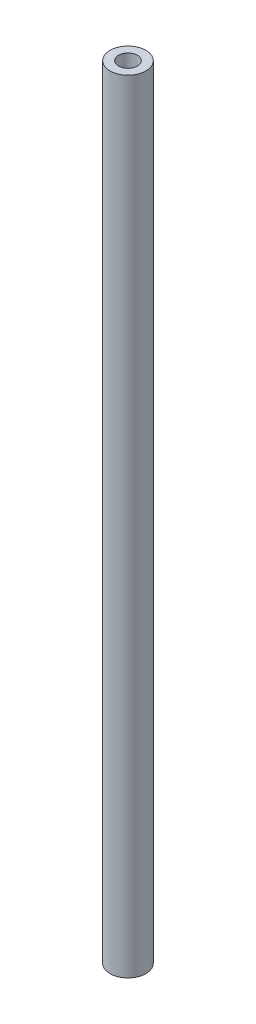
ISO-10303-21;
HEADER;
FILE_DESCRIPTION(('STEP AP214'),'2;1');
FILE_NAME('part.step','',(''),(''),'','','');
FILE_SCHEMA(('AUTOMOTIVE_DESIGN { 1 0 10303 214 1 1 1 1 }'));
ENDSEC;
DATA;
#1=APPLICATION_CONTEXT('core data for automotive mechanical design processes');
#2=APPLICATION_PROTOCOL_DEFINITION('international standard','automotive_design',2000,#1);
#3=PRODUCT_CONTEXT('',#1,'mechanical');
#4=PRODUCT('Part','Part','',(#3));
#5=PRODUCT_RELATED_PRODUCT_CATEGORY('part','',(#4));
#6=PRODUCT_DEFINITION_FORMATION('','',#4);
#7=PRODUCT_DEFINITION_CONTEXT('part definition',#1,'design');
#8=PRODUCT_DEFINITION('design','',#6,#7);
#9=PRODUCT_DEFINITION_SHAPE('','',#8);
#10=(LENGTH_UNIT() NAMED_UNIT(*) SI_UNIT(.MILLI.,.METRE.));
#11=(NAMED_UNIT(*) PLANE_ANGLE_UNIT() SI_UNIT($,.RADIAN.));
#12=(NAMED_UNIT(*) SI_UNIT($,.STERADIAN.) SOLID_ANGLE_UNIT());
#13=UNCERTAINTY_MEASURE_WITH_UNIT(LENGTH_MEASURE(1.E-05),#10,'distance_accuracy_value','');
#14=(GEOMETRIC_REPRESENTATION_CONTEXT(3) GLOBAL_UNCERTAINTY_ASSIGNED_CONTEXT((#13)) GLOBAL_UNIT_ASSIGNED_CONTEXT((#10,
#11,#12)) REPRESENTATION_CONTEXT('',''));
#15=CARTESIAN_POINT('',(0.,0.,0.));
#16=DIRECTION('',(0.,0.,1.));
#17=DIRECTION('',(1.,0.,0.));
#18=AXIS2_PLACEMENT_3D('',#15,#16,#17);
#19=CARTESIAN_POINT('',(0.,14.,0.));
#20=DIRECTION('',(0.,1.,0.));
#21=DIRECTION('',(0.,0.,1.));
#22=AXIS2_PLACEMENT_3D('',#19,#20,#21);
#23=PLANE('',#22);
#24=CARTESIAN_POINT('',(0.,14.,0.));
#25=DIRECTION('',(0.,1.,0.));
#26=DIRECTION('',(0.,0.,1.));
#27=AXIS2_PLACEMENT_3D('',#24,#25,#26);
#28=CIRCLE('',#27,0.3207);
#29=CARTESIAN_POINT('',(0.,14.,0.3207));
#30=VERTEX_POINT('',#29);
#31=EDGE_CURVE('E10',#30,#30,#28,.T.);
#32=ORIENTED_EDGE('',*,*,#31,.T.);
#33=EDGE_LOOP('',(#32));
#34=FACE_BOUND('',#33,.T.);
#35=CARTESIAN_POINT('',(0.,14.,0.));
#36=DIRECTION('',(0.,1.,0.));
#37=DIRECTION('',(0.,0.,1.));
#38=AXIS2_PLACEMENT_3D('',#35,#36,#37);
#39=CIRCLE('',#38,0.1685);
#40=CARTESIAN_POINT('',(0.,14.,0.1685));
#41=VERTEX_POINT('',#40);
#42=EDGE_CURVE('E42',#41,#41,#39,.T.);
#43=ORIENTED_EDGE('',*,*,#42,.F.);
#44=EDGE_LOOP('',(#43));
#45=FACE_BOUND('',#44,.T.);
#46=ADVANCED_FACE('F31',(#34,#45),#23,.T.);
#47=CARTESIAN_POINT('',(0.,0.,0.));
#48=DIRECTION('',(0.,1.,0.));
#49=DIRECTION('',(0.,0.,1.));
#50=AXIS2_PLACEMENT_3D('',#47,#48,#49);
#51=PLANE('',#50);
#52=CARTESIAN_POINT('',(0.,0.,0.));
#53=DIRECTION('',(0.,1.,0.));
#54=DIRECTION('',(0.,0.,1.));
#55=AXIS2_PLACEMENT_3D('',#52,#53,#54);
#56=CIRCLE('',#55,0.3207);
#57=CARTESIAN_POINT('',(0.,0.,0.3207));
#58=VERTEX_POINT('',#57);
#59=EDGE_CURVE('E35',#58,#58,#56,.T.);
#60=ORIENTED_EDGE('',*,*,#59,.F.);
#61=EDGE_LOOP('',(#60));
#62=FACE_BOUND('',#61,.T.);
#63=CARTESIAN_POINT('',(0.,0.,0.));
#64=DIRECTION('',(0.,1.,0.));
#65=DIRECTION('',(0.,0.,1.));
#66=AXIS2_PLACEMENT_3D('',#63,#64,#65);
#67=CIRCLE('',#66,0.1685);
#68=CARTESIAN_POINT('',(0.,0.,0.1685));
#69=VERTEX_POINT('',#68);
#70=EDGE_CURVE('E44',#69,#69,#67,.T.);
#71=ORIENTED_EDGE('',*,*,#70,.T.);
#72=EDGE_LOOP('',(#71));
#73=FACE_BOUND('',#72,.T.);
#74=ADVANCED_FACE('F54',(#62,#73),#51,.F.);
#75=CARTESIAN_POINT('',(0.,14.,0.));
#76=DIRECTION('',(0.,-1.,0.));
#77=DIRECTION('',(0.,0.,-1.));
#78=AXIS2_PLACEMENT_3D('',#75,#76,#77);
#79=CYLINDRICAL_SURFACE('',#78,0.3207);
#80=ORIENTED_EDGE('',*,*,#31,.F.);
#81=EDGE_LOOP('',(#80));
#82=FACE_BOUND('',#81,.T.);
#83=ORIENTED_EDGE('',*,*,#59,.T.);
#84=EDGE_LOOP('',(#83));
#85=FACE_BOUND('',#84,.T.);
#86=ADVANCED_FACE('F33',(#82,#85),#79,.T.);
#87=CARTESIAN_POINT('',(0.,14.,0.));
#88=DIRECTION('',(0.,-1.,0.));
#89=DIRECTION('',(0.,0.,-1.));
#90=AXIS2_PLACEMENT_3D('',#87,#88,#89);
#91=CYLINDRICAL_SURFACE('',#90,0.1685);
#92=ORIENTED_EDGE('',*,*,#42,.T.);
#93=EDGE_LOOP('',(#92));
#94=FACE_BOUND('',#93,.T.);
#95=ORIENTED_EDGE('',*,*,#70,.F.);
#96=EDGE_LOOP('',(#95));
#97=FACE_BOUND('',#96,.T.);
#98=ADVANCED_FACE('F50',(#94,#97),#91,.F.);
#99=CLOSED_SHELL('',(#46,#74,#86,#98));
#100=MANIFOLD_SOLID_BREP('B2',#99);
#101=ADVANCED_BREP_SHAPE_REPRESENTATION('',(#18,#100),#14);
#102=SHAPE_DEFINITION_REPRESENTATION(#9,#101);
ENDSEC;
END-ISO-10303-21;
